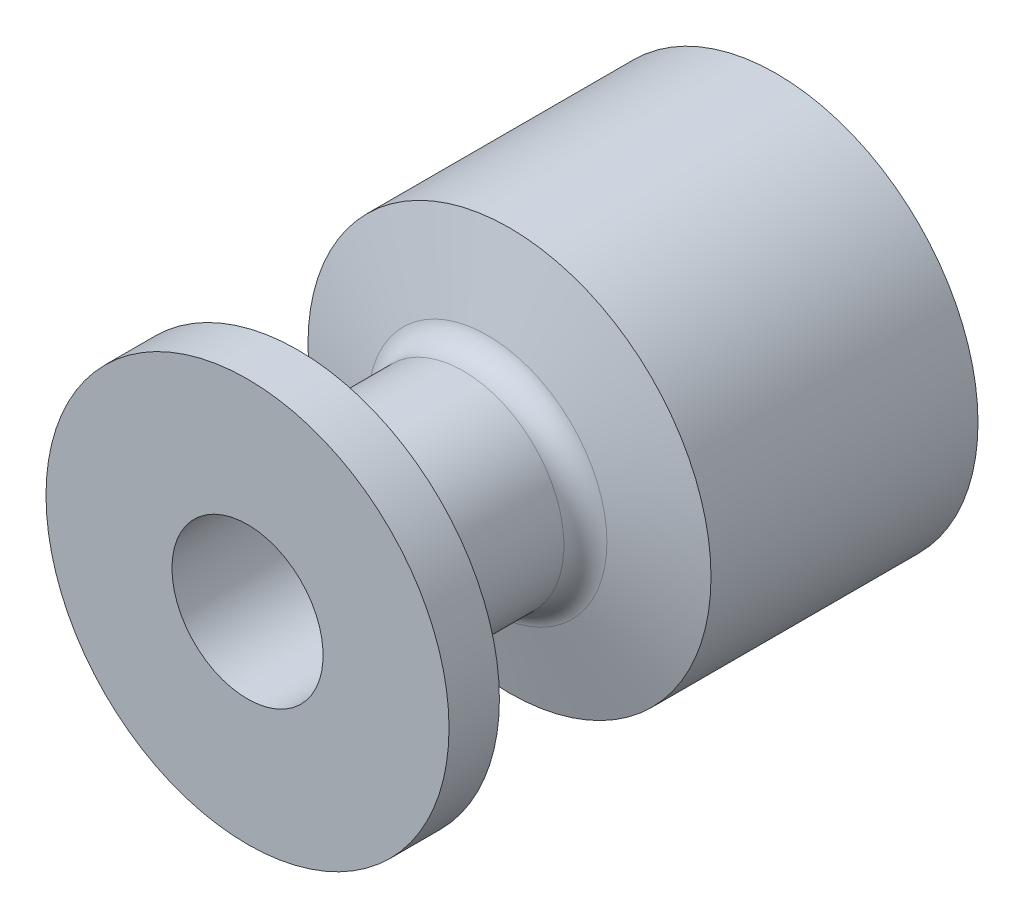
ISO-10303-21;
HEADER;
FILE_DESCRIPTION(('STEP AP214'),'2;1');
FILE_NAME('part.step','',(''),(''),'','','');
FILE_SCHEMA(('AUTOMOTIVE_DESIGN { 1 0 10303 214 1 1 1 1 }'));
ENDSEC;
DATA;
#1=APPLICATION_CONTEXT('core data for automotive mechanical design processes');
#2=APPLICATION_PROTOCOL_DEFINITION('international standard','automotive_design',2000,#1);
#3=PRODUCT_CONTEXT('',#1,'mechanical');
#4=PRODUCT('Part','Part','',(#3));
#5=PRODUCT_RELATED_PRODUCT_CATEGORY('part','',(#4));
#6=PRODUCT_DEFINITION_FORMATION('','',#4);
#7=PRODUCT_DEFINITION_CONTEXT('part definition',#1,'design');
#8=PRODUCT_DEFINITION('design','',#6,#7);
#9=PRODUCT_DEFINITION_SHAPE('','',#8);
#10=(LENGTH_UNIT() NAMED_UNIT(*) SI_UNIT(.MILLI.,.METRE.));
#11=(NAMED_UNIT(*) PLANE_ANGLE_UNIT() SI_UNIT($,.RADIAN.));
#12=(NAMED_UNIT(*) SI_UNIT($,.STERADIAN.) SOLID_ANGLE_UNIT());
#13=UNCERTAINTY_MEASURE_WITH_UNIT(LENGTH_MEASURE(1.E-05),#10,'distance_accuracy_value','');
#14=(GEOMETRIC_REPRESENTATION_CONTEXT(3) GLOBAL_UNCERTAINTY_ASSIGNED_CONTEXT((#13)) GLOBAL_UNIT_ASSIGNED_CONTEXT((#10,
#11,#12)) REPRESENTATION_CONTEXT('',''));
#15=CARTESIAN_POINT('',(0.,0.,0.));
#16=DIRECTION('',(0.,0.,1.));
#17=DIRECTION('',(1.,0.,0.));
#18=AXIS2_PLACEMENT_3D('',#15,#16,#17);
#19=CARTESIAN_POINT('',(0.,0.,10.5));
#20=DIRECTION('',(0.,0.,1.));
#21=DIRECTION('',(1.,0.,0.));
#22=AXIS2_PLACEMENT_3D('',#19,#20,#21);
#23=PLANE('',#22);
#24=CARTESIAN_POINT('',(0.,0.,10.5));
#25=DIRECTION('',(0.,0.,1.));
#26=DIRECTION('',(1.,0.,0.));
#27=AXIS2_PLACEMENT_3D('',#24,#25,#26);
#28=CIRCLE('',#27,4.);
#29=CARTESIAN_POINT('',(-4.,0.,10.5));
#30=VERTEX_POINT('',#29);
#31=EDGE_CURVE('E52',#30,#30,#28,.T.);
#32=ORIENTED_EDGE('',*,*,#31,.T.);
#33=EDGE_LOOP('',(#32));
#34=FACE_BOUND('',#33,.T.);
#35=CARTESIAN_POINT('',(0.,0.,10.5));
#36=DIRECTION('',(0.,0.,1.));
#37=DIRECTION('',(1.,0.,0.));
#38=AXIS2_PLACEMENT_3D('',#35,#36,#37);
#39=CIRCLE('',#38,1.5);
#40=CARTESIAN_POINT('',(-1.5,0.,10.5));
#41=VERTEX_POINT('',#40);
#42=EDGE_CURVE('E56',#41,#41,#39,.T.);
#43=ORIENTED_EDGE('',*,*,#42,.F.);
#44=EDGE_LOOP('',(#43));
#45=FACE_BOUND('',#44,.T.);
#46=ADVANCED_FACE('F32',(#34,#45),#23,.T.);
#47=CARTESIAN_POINT('',(0.,0.,10.5));
#48=DIRECTION('',(0.,0.,-1.));
#49=DIRECTION('',(-1.,0.,0.));
#50=AXIS2_PLACEMENT_3D('',#47,#48,#49);
#51=CYLINDRICAL_SURFACE('',#50,4.);
#52=CARTESIAN_POINT('',(0.,0.,9.5));
#53=DIRECTION('',(0.,0.,-1.));
#54=DIRECTION('',(-1.,0.,0.));
#55=AXIS2_PLACEMENT_3D('',#52,#53,#54);
#56=CIRCLE('',#55,4.);
#57=CARTESIAN_POINT('',(-4.,0.,9.5));
#58=VERTEX_POINT('',#57);
#59=EDGE_CURVE('E65',#58,#58,#56,.T.);
#60=CARTESIAN_POINT('',(-4.,0.,9.5));
#61=CARTESIAN_POINT('',(-4.,0.,9.51041666666667));
#62=CARTESIAN_POINT('',(-4.,0.,9.52083333333334));
#63=CARTESIAN_POINT('',(-4.,0.,9.54166666666667));
#64=CARTESIAN_POINT('',(-4.,0.,9.55208333333333));
#65=CARTESIAN_POINT('',(-4.,0.,9.57291666666667));
#66=CARTESIAN_POINT('',(-4.,0.,9.58333333333333));
#67=CARTESIAN_POINT('',(-4.,0.,9.60416666666667));
#68=CARTESIAN_POINT('',(-4.,0.,9.61458333333333));
#69=CARTESIAN_POINT('',(-4.,0.,9.63541666666667));
#70=CARTESIAN_POINT('',(-4.,0.,9.64583333333333));
#71=CARTESIAN_POINT('',(-4.,0.,9.66666666666667));
#72=CARTESIAN_POINT('',(-4.,0.,9.67708333333333));
#73=CARTESIAN_POINT('',(-4.,0.,9.69791666666667));
#74=CARTESIAN_POINT('',(-4.,0.,9.70833333333333));
#75=CARTESIAN_POINT('',(-4.,0.,9.72916666666667));
#76=CARTESIAN_POINT('',(-4.,0.,9.73958333333333));
#77=CARTESIAN_POINT('',(-4.,0.,9.76041666666667));
#78=CARTESIAN_POINT('',(-4.,0.,9.77083333333333));
#79=CARTESIAN_POINT('',(-4.,0.,9.79166666666667));
#80=CARTESIAN_POINT('',(-4.,0.,9.80208333333333));
#81=CARTESIAN_POINT('',(-4.,0.,9.82291666666667));
#82=CARTESIAN_POINT('',(-4.,0.,9.83333333333333));
#83=CARTESIAN_POINT('',(-4.,0.,9.85416666666667));
#84=CARTESIAN_POINT('',(-4.,0.,9.86458333333333));
#85=CARTESIAN_POINT('',(-4.,0.,9.88541666666667));
#86=CARTESIAN_POINT('',(-4.,0.,9.89583333333333));
#87=CARTESIAN_POINT('',(-4.,0.,9.91666666666667));
#88=CARTESIAN_POINT('',(-4.,0.,9.92708333333333));
#89=CARTESIAN_POINT('',(-4.,0.,9.94791666666667));
#90=CARTESIAN_POINT('',(-4.,0.,9.95833333333333));
#91=CARTESIAN_POINT('',(-4.,0.,9.97916666666667));
#92=CARTESIAN_POINT('',(-4.,0.,9.98958333333333));
#93=CARTESIAN_POINT('',(-4.,0.,10.0104166666667));
#94=CARTESIAN_POINT('',(-4.,0.,10.0208333333333));
#95=CARTESIAN_POINT('',(-4.,0.,10.0416666666667));
#96=CARTESIAN_POINT('',(-4.,0.,10.0520833333333));
#97=CARTESIAN_POINT('',(-4.,0.,10.0729166666667));
#98=CARTESIAN_POINT('',(-4.,0.,10.0833333333333));
#99=CARTESIAN_POINT('',(-4.,0.,10.1041666666667));
#100=CARTESIAN_POINT('',(-4.,0.,10.1145833333333));
#101=CARTESIAN_POINT('',(-4.,0.,10.1354166666667));
#102=CARTESIAN_POINT('',(-4.,0.,10.1458333333333));
#103=CARTESIAN_POINT('',(-4.,0.,10.1666666666667));
#104=CARTESIAN_POINT('',(-4.,0.,10.1770833333333));
#105=CARTESIAN_POINT('',(-4.,0.,10.1979166666667));
#106=CARTESIAN_POINT('',(-4.,0.,10.2083333333333));
#107=CARTESIAN_POINT('',(-4.,0.,10.2291666666667));
#108=CARTESIAN_POINT('',(-4.,0.,10.2395833333333));
#109=CARTESIAN_POINT('',(-4.,0.,10.2604166666667));
#110=CARTESIAN_POINT('',(-4.,0.,10.2708333333333));
#111=CARTESIAN_POINT('',(-4.,0.,10.2916666666667));
#112=CARTESIAN_POINT('',(-4.,0.,10.3020833333333));
#113=CARTESIAN_POINT('',(-4.,0.,10.3229166666667));
#114=CARTESIAN_POINT('',(-4.,0.,10.3333333333333));
#115=CARTESIAN_POINT('',(-4.,0.,10.3541666666667));
#116=CARTESIAN_POINT('',(-4.,0.,10.3645833333333));
#117=CARTESIAN_POINT('',(-4.,0.,10.3854166666667));
#118=CARTESIAN_POINT('',(-4.,0.,10.3958333333333));
#119=CARTESIAN_POINT('',(-4.,0.,10.4166666666667));
#120=CARTESIAN_POINT('',(-4.,0.,10.4270833333333));
#121=CARTESIAN_POINT('',(-4.,0.,10.4479166666667));
#122=CARTESIAN_POINT('',(-4.,0.,10.4583333333333));
#123=CARTESIAN_POINT('',(-4.,0.,10.4791666666667));
#124=CARTESIAN_POINT('',(-4.,0.,10.4895833333333));
#125=CARTESIAN_POINT('',(-4.,0.,10.5));
#126=B_SPLINE_CURVE_WITH_KNOTS('',3,(#60,#61,#62,#63,#64,#65,#66,#67,#68,#69,#70,#71,#72,#73,
#74,#75,#76,#77,#78,#79,#80,#81,#82,#83,#84,#85,#86,#87,#88,#89,#90,#91,#92,#93,#94,#95,#96,#97,
#98,#99,#100,#101,#102,#103,#104,#105,#106,#107,#108,#109,#110,#111,#112,#113,#114,#115,#116,
#117,#118,#119,#120,#121,#122,#123,#124,#125),.UNSPECIFIED.,.F.,.F.,(4,2,2,2,2,2,2,2,2,2,2,2,2,
2,2,2,2,2,2,2,2,2,2,2,2,2,2,2,2,2,2,2,4),(0.,0.0312499999999983,0.0624999999999983,
0.0937499999999983,0.124999999999998,0.156249999999998,0.187499999999998,0.218749999999998,
0.249999999999999,0.281249999999999,0.312499999999999,0.343749999999999,0.374999999999999,
0.406249999999999,0.437499999999999,0.468749999999999,0.499999999999999,0.531249999999997,
0.562499999999997,0.593749999999997,0.624999999999997,0.656249999999997,0.687499999999997,
0.718749999999997,0.749999999999997,0.781249999999997,0.812499999999997,0.843749999999997,
0.874999999999997,0.906249999999997,0.937499999999997,0.968749999999997,0.999999999999997),.UNSPECIFIED.);
#127=EDGE_CURVE('BSEAM98',#58,#30,#126,.T.);
#128=ORIENTED_EDGE('',*,*,#59,.F.);
#129=ORIENTED_EDGE('',*,*,#31,.F.);
#130=ORIENTED_EDGE('',*,*,#127,.T.);
#131=ORIENTED_EDGE('',*,*,#127,.F.);
#132=EDGE_LOOP('',(#128,#130,#129,#131));
#133=FACE_BOUND('',#132,.T.);
#134=ADVANCED_FACE('F98',(#133),#51,.T.);
#135=CARTESIAN_POINT('',(0.,0.,10.5));
#136=DIRECTION('',(0.,0.,-1.));
#137=DIRECTION('',(-1.,0.,0.));
#138=AXIS2_PLACEMENT_3D('',#135,#136,#137);
#139=CYLINDRICAL_SURFACE('',#138,1.5);
#140=CARTESIAN_POINT('',(0.,0.,0.65));
#141=DIRECTION('',(0.,0.,1.));
#142=DIRECTION('',(1.,0.,0.));
#143=AXIS2_PLACEMENT_3D('',#140,#141,#142);
#144=CIRCLE('',#143,1.5);
#145=CARTESIAN_POINT('',(-1.5,0.,0.650000000000001));
#146=VERTEX_POINT('',#145);
#147=EDGE_CURVE('E53',#146,#146,#144,.T.);
#148=CARTESIAN_POINT('',(-1.5,0.,0.650000000000001));
#149=CARTESIAN_POINT('',(-1.5,0.,0.752604166666668));
#150=CARTESIAN_POINT('',(-1.5,0.,0.855208333333335));
#151=CARTESIAN_POINT('',(-1.5,0.,1.06041666666667));
#152=CARTESIAN_POINT('',(-1.5,0.,1.16302083333333));
#153=CARTESIAN_POINT('',(-1.5,0.,1.36822916666667));
#154=CARTESIAN_POINT('',(-1.5,0.,1.47083333333333));
#155=CARTESIAN_POINT('',(-1.5,0.,1.67604166666667));
#156=CARTESIAN_POINT('',(-1.5,0.,1.77864583333333));
#157=CARTESIAN_POINT('',(-1.5,0.,1.98385416666667));
#158=CARTESIAN_POINT('',(-1.5,0.,2.08645833333333));
#159=CARTESIAN_POINT('',(-1.5,0.,2.29166666666667));
#160=CARTESIAN_POINT('',(-1.5,0.,2.39427083333333));
#161=CARTESIAN_POINT('',(-1.5,0.,2.59947916666667));
#162=CARTESIAN_POINT('',(-1.5,0.,2.70208333333333));
#163=CARTESIAN_POINT('',(-1.5,0.,2.90729166666667));
#164=CARTESIAN_POINT('',(-1.5,0.,3.00989583333333));
#165=CARTESIAN_POINT('',(-1.5,0.,3.21510416666667));
#166=CARTESIAN_POINT('',(-1.5,0.,3.31770833333333));
#167=CARTESIAN_POINT('',(-1.5,0.,3.52291666666667));
#168=CARTESIAN_POINT('',(-1.5,0.,3.62552083333333));
#169=CARTESIAN_POINT('',(-1.5,0.,3.83072916666667));
#170=CARTESIAN_POINT('',(-1.5,0.,3.93333333333333));
#171=CARTESIAN_POINT('',(-1.5,0.,4.13854166666667));
#172=CARTESIAN_POINT('',(-1.5,0.,4.24114583333333));
#173=CARTESIAN_POINT('',(-1.5,0.,4.44635416666667));
#174=CARTESIAN_POINT('',(-1.5,0.,4.54895833333333));
#175=CARTESIAN_POINT('',(-1.5,0.,4.75416666666667));
#176=CARTESIAN_POINT('',(-1.5,0.,4.85677083333333));
#177=CARTESIAN_POINT('',(-1.5,0.,5.06197916666667));
#178=CARTESIAN_POINT('',(-1.5,0.,5.16458333333333));
#179=CARTESIAN_POINT('',(-1.5,0.,5.36979166666667));
#180=CARTESIAN_POINT('',(-1.5,0.,5.47239583333333));
#181=CARTESIAN_POINT('',(-1.5,0.,5.67760416666667));
#182=CARTESIAN_POINT('',(-1.5,0.,5.78020833333333));
#183=CARTESIAN_POINT('',(-1.5,0.,5.98541666666667));
#184=CARTESIAN_POINT('',(-1.5,0.,6.08802083333333));
#185=CARTESIAN_POINT('',(-1.5,0.,6.29322916666667));
#186=CARTESIAN_POINT('',(-1.5,0.,6.39583333333333));
#187=CARTESIAN_POINT('',(-1.5,0.,6.60104166666667));
#188=CARTESIAN_POINT('',(-1.5,0.,6.70364583333333));
#189=CARTESIAN_POINT('',(-1.5,0.,6.90885416666667));
#190=CARTESIAN_POINT('',(-1.5,0.,7.01145833333333));
#191=CARTESIAN_POINT('',(-1.5,0.,7.21666666666667));
#192=CARTESIAN_POINT('',(-1.5,0.,7.31927083333333));
#193=CARTESIAN_POINT('',(-1.5,0.,7.52447916666667));
#194=CARTESIAN_POINT('',(-1.5,0.,7.62708333333333));
#195=CARTESIAN_POINT('',(-1.5,0.,7.83229166666667));
#196=CARTESIAN_POINT('',(-1.5,0.,7.93489583333333));
#197=CARTESIAN_POINT('',(-1.5,0.,8.14010416666667));
#198=CARTESIAN_POINT('',(-1.5,0.,8.24270833333333));
#199=CARTESIAN_POINT('',(-1.5,0.,8.44791666666667));
#200=CARTESIAN_POINT('',(-1.5,0.,8.55052083333333));
#201=CARTESIAN_POINT('',(-1.5,0.,8.75572916666667));
#202=CARTESIAN_POINT('',(-1.5,0.,8.85833333333333));
#203=CARTESIAN_POINT('',(-1.5,0.,9.06354166666667));
#204=CARTESIAN_POINT('',(-1.5,0.,9.16614583333333));
#205=CARTESIAN_POINT('',(-1.5,0.,9.37135416666666));
#206=CARTESIAN_POINT('',(-1.5,0.,9.47395833333333));
#207=CARTESIAN_POINT('',(-1.5,0.,9.67916666666667));
#208=CARTESIAN_POINT('',(-1.5,0.,9.78177083333333));
#209=CARTESIAN_POINT('',(-1.5,0.,9.98697916666666));
#210=CARTESIAN_POINT('',(-1.5,0.,10.0895833333333));
#211=CARTESIAN_POINT('',(-1.5,0.,10.2947916666667));
#212=CARTESIAN_POINT('',(-1.5,0.,10.3973958333333));
#213=CARTESIAN_POINT('',(-1.5,0.,10.5));
#214=B_SPLINE_CURVE_WITH_KNOTS('',3,(#148,#149,#150,#151,#152,#153,#154,#155,#156,#157,#158,
#159,#160,#161,#162,#163,#164,#165,#166,#167,#168,#169,#170,#171,#172,#173,#174,#175,#176,#177,
#178,#179,#180,#181,#182,#183,#184,#185,#186,#187,#188,#189,#190,#191,#192,#193,#194,#195,#196,
#197,#198,#199,#200,#201,#202,#203,#204,#205,#206,#207,#208,#209,#210,#211,#212,#213),
.UNSPECIFIED.,.F.,.F.,(4,2,2,2,2,2,2,2,2,2,2,2,2,2,2,2,2,2,2,2,2,2,2,2,2,2,2,2,2,2,2,2,4),(0.,
0.307812500000001,0.615625,0.923437500000001,1.23125,1.5390625,1.846875,2.1546875,2.4625,
2.7703125,3.078125,3.3859375,3.69375,4.0015625,4.309375,4.6171875,4.925,5.2328125,5.540625,
5.8484375,6.15625,6.4640625,6.771875,7.0796875,7.3875,7.6953125,8.003125,8.3109375,8.61875,
8.9265625,9.234375,9.5421875,9.85),.UNSPECIFIED.);
#215=EDGE_CURVE('BSEAM82',#146,#41,#214,.T.);
#216=ORIENTED_EDGE('',*,*,#147,.F.);
#217=ORIENTED_EDGE('',*,*,#42,.T.);
#218=ORIENTED_EDGE('',*,*,#215,.T.);
#219=ORIENTED_EDGE('',*,*,#215,.F.);
#220=EDGE_LOOP('',(#216,#218,#217,#219));
#221=FACE_BOUND('',#220,.T.);
#222=ADVANCED_FACE('F82',(#221),#139,.F.);
#223=CARTESIAN_POINT('',(0.,0.,0.));
#224=DIRECTION('',(0.,0.,-1.));
#225=DIRECTION('',(-1.,0.,0.));
#226=AXIS2_PLACEMENT_3D('',#223,#224,#225);
#227=CONICAL_SURFACE('',#226,3.62463983518624,0.872664625997166);
#228=CARTESIAN_POINT('',(0.,0.,0.65));
#229=DIRECTION('',(0.,0.,-1.));
#230=DIRECTION('',(-1.,0.,0.));
#231=AXIS2_PLACEMENT_3D('',#228,#229,#230);
#232=CIRCLE('',#231,2.85);
#233=CARTESIAN_POINT('',(-2.85,0.,0.65));
#234=VERTEX_POINT('',#233);
#235=EDGE_CURVE('E68',#234,#234,#232,.T.);
#236=ORIENTED_EDGE('',*,*,#235,.F.);
#237=EDGE_LOOP('',(#236));
#238=FACE_BOUND('',#237,.T.);
#239=CARTESIAN_POINT('',(0.,0.,0.));
#240=DIRECTION('',(0.,0.,-1.));
#241=DIRECTION('',(-1.,0.,0.));
#242=AXIS2_PLACEMENT_3D('',#239,#240,#241);
#243=CIRCLE('',#242,3.62463983518624);
#244=CARTESIAN_POINT('',(-3.62463983518624,0.,0.));
#245=VERTEX_POINT('',#244);
#246=EDGE_CURVE('E57',#245,#245,#243,.T.);
#247=ORIENTED_EDGE('',*,*,#246,.T.);
#248=EDGE_LOOP('',(#247));
#249=FACE_BOUND('',#248,.T.);
#250=ADVANCED_FACE('F79',(#238,#249),#227,.F.);
#251=CARTESIAN_POINT('',(-2.85,0.,0.65));
#252=DIRECTION('',(0.,0.,1.));
#253=DIRECTION('',(1.,0.,0.));
#254=AXIS2_PLACEMENT_3D('',#251,#252,#253);
#255=PLANE('',#254);
#256=ORIENTED_EDGE('',*,*,#147,.T.);
#257=EDGE_LOOP('',(#256));
#258=FACE_BOUND('',#257,.T.);
#259=ORIENTED_EDGE('',*,*,#235,.T.);
#260=EDGE_LOOP('',(#259));
#261=FACE_BOUND('',#260,.T.);
#262=ADVANCED_FACE('F77',(#258,#261),#255,.F.);
#263=CARTESIAN_POINT('',(0.,0.,5.83589838486224));
#264=DIRECTION('',(0.,0.,-1.));
#265=DIRECTION('',(-1.,0.,0.));
#266=AXIS2_PLACEMENT_3D('',#263,#264,#265);
#267=CONICAL_SURFACE('',#266,2.,1.30899693899575);
#268=CARTESIAN_POINT('',(0.,0.,5.73659896570719));
#269=DIRECTION('',(0.,0.,-1.));
#270=DIRECTION('',(-1.,0.,0.));
#271=AXIS2_PLACEMENT_3D('',#268,#269,#270);
#272=CIRCLE('',#271,2.37059047744874);
#273=CARTESIAN_POINT('',(-2.37059047744874,0.,5.73659896570719));
#274=VERTEX_POINT('',#273);
#275=EDGE_CURVE('E10',#274,#274,#272,.T.);
#276=ORIENTED_EDGE('',*,*,#275,.T.);
#277=EDGE_LOOP('',(#276));
#278=FACE_BOUND('',#277,.T.);
#279=CARTESIAN_POINT('',(0.,0.,5.3));
#280=DIRECTION('',(0.,0.,-1.));
#281=DIRECTION('',(-1.,0.,0.));
#282=AXIS2_PLACEMENT_3D('',#279,#280,#281);
#283=CIRCLE('',#282,4.);
#284=CARTESIAN_POINT('',(-4.,0.,5.3));
#285=VERTEX_POINT('',#284);
#286=EDGE_CURVE('E69',#285,#285,#283,.T.);
#287=ORIENTED_EDGE('',*,*,#286,.F.);
#288=EDGE_LOOP('',(#287));
#289=FACE_BOUND('',#288,.T.);
#290=ADVANCED_FACE('F116',(#278,#289),#267,.T.);
#291=CARTESIAN_POINT('',(0.,0.,0.));
#292=DIRECTION('',(0.,0.,-1.));
#293=DIRECTION('',(-1.,0.,0.));
#294=AXIS2_PLACEMENT_3D('',#291,#292,#293);
#295=CYLINDRICAL_SURFACE('',#294,2.);
#296=CARTESIAN_POINT('',(0.,0.,8.4868893435315));
#297=DIRECTION('',(0.,0.,-1.));
#298=DIRECTION('',(-1.,0.,0.));
#299=AXIS2_PLACEMENT_3D('',#296,#297,#298);
#300=CIRCLE('',#299,2.);
#301=CARTESIAN_POINT('',(-2.,0.,8.4868893435315));
#302=VERTEX_POINT('',#301);
#303=EDGE_CURVE('E43',#302,#302,#300,.T.);
#304=ORIENTED_EDGE('',*,*,#303,.T.);
#305=EDGE_LOOP('',(#304));
#306=FACE_BOUND('',#305,.T.);
#307=CARTESIAN_POINT('',(0.,0.,6.21956187885172));
#308=DIRECTION('',(0.,0.,-1.));
#309=DIRECTION('',(-1.,0.,0.));
#310=AXIS2_PLACEMENT_3D('',#307,#308,#309);
#311=CIRCLE('',#310,2.);
#312=CARTESIAN_POINT('',(-2.,0.,6.21956187885172));
#313=VERTEX_POINT('',#312);
#314=EDGE_CURVE('E47',#313,#313,#311,.F.);
#315=ORIENTED_EDGE('',*,*,#314,.T.);
#316=EDGE_LOOP('',(#315));
#317=FACE_BOUND('',#316,.T.);
#318=ADVANCED_FACE('F102',(#306,#317),#295,.T.);
#319=CARTESIAN_POINT('',(0.,0.,9.5));
#320=DIRECTION('',(0.,0.,1.));
#321=DIRECTION('',(1.,0.,0.));
#322=AXIS2_PLACEMENT_3D('',#319,#320,#321);
#323=CONICAL_SURFACE('',#322,4.,1.25663706143591);
#324=CARTESIAN_POINT('',(0.,0.,8.96241760167907));
#325=DIRECTION('',(0.,0.,1.));
#326=DIRECTION('',(1.,0.,0.));
#327=AXIS2_PLACEMENT_3D('',#324,#325,#326);
#328=CIRCLE('',#327,2.34549150281252);
#329=CARTESIAN_POINT('',(2.34549150281253,0.,8.96241760167907));
#330=VERTEX_POINT('',#329);
#331=EDGE_CURVE('E39',#330,#330,#328,.T.);
#332=ORIENTED_EDGE('',*,*,#331,.T.);
#333=EDGE_LOOP('',(#332));
#334=FACE_BOUND('',#333,.T.);
#335=ORIENTED_EDGE('',*,*,#59,.T.);
#336=EDGE_LOOP('',(#335));
#337=FACE_BOUND('',#336,.T.);
#338=ADVANCED_FACE('F95',(#334,#337),#323,.T.);
#339=CARTESIAN_POINT('',(0.,0.,0.));
#340=DIRECTION('',(0.,0.,1.));
#341=DIRECTION('',(1.,0.,0.));
#342=AXIS2_PLACEMENT_3D('',#339,#340,#341);
#343=CIRCLE('',#342,4.);
#344=CARTESIAN_POINT('',(-4.,0.,0.));
#345=VERTEX_POINT('',#344);
#346=EDGE_CURVE('E58',#345,#345,#343,.T.);
#347=CARTESIAN_POINT('',(-4.,0.,5.3));
#348=CARTESIAN_POINT('',(-4.,0.,5.24479166666667));
#349=CARTESIAN_POINT('',(-4.,0.,5.18958333333333));
#350=CARTESIAN_POINT('',(-4.,0.,5.07916666666667));
#351=CARTESIAN_POINT('',(-4.,0.,5.02395833333333));
#352=CARTESIAN_POINT('',(-4.,0.,4.91354166666667));
#353=CARTESIAN_POINT('',(-4.,0.,4.85833333333333));
#354=CARTESIAN_POINT('',(-4.,0.,4.74791666666667));
#355=CARTESIAN_POINT('',(-4.,0.,4.69270833333333));
#356=CARTESIAN_POINT('',(-4.,0.,4.58229166666667));
#357=CARTESIAN_POINT('',(-4.,0.,4.52708333333333));
#358=CARTESIAN_POINT('',(-4.,0.,4.41666666666667));
#359=CARTESIAN_POINT('',(-4.,0.,4.36145833333333));
#360=CARTESIAN_POINT('',(-4.,0.,4.25104166666667));
#361=CARTESIAN_POINT('',(-4.,0.,4.19583333333333));
#362=CARTESIAN_POINT('',(-4.,0.,4.08541666666667));
#363=CARTESIAN_POINT('',(-4.,0.,4.03020833333333));
#364=CARTESIAN_POINT('',(-4.,0.,3.91979166666667));
#365=CARTESIAN_POINT('',(-4.,0.,3.86458333333333));
#366=CARTESIAN_POINT('',(-4.,0.,3.75416666666667));
#367=CARTESIAN_POINT('',(-4.,0.,3.69895833333333));
#368=CARTESIAN_POINT('',(-4.,0.,3.58854166666667));
#369=CARTESIAN_POINT('',(-4.,0.,3.53333333333333));
#370=CARTESIAN_POINT('',(-4.,0.,3.42291666666667));
#371=CARTESIAN_POINT('',(-4.,0.,3.36770833333333));
#372=CARTESIAN_POINT('',(-4.,0.,3.25729166666667));
#373=CARTESIAN_POINT('',(-4.,0.,3.20208333333333));
#374=CARTESIAN_POINT('',(-4.,0.,3.09166666666667));
#375=CARTESIAN_POINT('',(-4.,0.,3.03645833333333));
#376=CARTESIAN_POINT('',(-4.,0.,2.92604166666667));
#377=CARTESIAN_POINT('',(-4.,0.,2.87083333333333));
#378=CARTESIAN_POINT('',(-4.,0.,2.76041666666667));
#379=CARTESIAN_POINT('',(-4.,0.,2.70520833333333));
#380=CARTESIAN_POINT('',(-4.,0.,2.59479166666667));
#381=CARTESIAN_POINT('',(-4.,0.,2.53958333333333));
#382=CARTESIAN_POINT('',(-4.,0.,2.42916666666667));
#383=CARTESIAN_POINT('',(-4.,0.,2.37395833333333));
#384=CARTESIAN_POINT('',(-4.,0.,2.26354166666667));
#385=CARTESIAN_POINT('',(-4.,0.,2.20833333333333));
#386=CARTESIAN_POINT('',(-4.,0.,2.09791666666667));
#387=CARTESIAN_POINT('',(-4.,0.,2.04270833333333));
#388=CARTESIAN_POINT('',(-4.,0.,1.93229166666667));
#389=CARTESIAN_POINT('',(-4.,0.,1.87708333333333));
#390=CARTESIAN_POINT('',(-4.,0.,1.76666666666667));
#391=CARTESIAN_POINT('',(-4.,0.,1.71145833333333));
#392=CARTESIAN_POINT('',(-4.,0.,1.60104166666667));
#393=CARTESIAN_POINT('',(-4.,0.,1.54583333333333));
#394=CARTESIAN_POINT('',(-4.,0.,1.43541666666667));
#395=CARTESIAN_POINT('',(-4.,0.,1.38020833333333));
#396=CARTESIAN_POINT('',(-4.,0.,1.26979166666667));
#397=CARTESIAN_POINT('',(-4.,0.,1.21458333333333));
#398=CARTESIAN_POINT('',(-4.,0.,1.10416666666667));
#399=CARTESIAN_POINT('',(-4.,0.,1.04895833333333));
#400=CARTESIAN_POINT('',(-4.,0.,0.938541666666666));
#401=CARTESIAN_POINT('',(-4.,0.,0.883333333333333));
#402=CARTESIAN_POINT('',(-4.,0.,0.772916666666666));
#403=CARTESIAN_POINT('',(-4.,0.,0.717708333333333));
#404=CARTESIAN_POINT('',(-4.,0.,0.607291666666667));
#405=CARTESIAN_POINT('',(-4.,0.,0.552083333333334));
#406=CARTESIAN_POINT('',(-4.,0.,0.441666666666667));
#407=CARTESIAN_POINT('',(-4.,0.,0.386458333333334));
#408=CARTESIAN_POINT('',(-4.,0.,0.276041666666666));
#409=CARTESIAN_POINT('',(-4.,0.,0.220833333333333));
#410=CARTESIAN_POINT('',(-4.,0.,0.110416666666666));
#411=CARTESIAN_POINT('',(-4.,0.,0.055208333333333));
#412=CARTESIAN_POINT('',(-4.,0.,0.));
#413=B_SPLINE_CURVE_WITH_KNOTS('',3,(#347,#348,#349,#350,#351,#352,#353,#354,#355,#356,#357,
#358,#359,#360,#361,#362,#363,#364,#365,#366,#367,#368,#369,#370,#371,#372,#373,#374,#375,#376,
#377,#378,#379,#380,#381,#382,#383,#384,#385,#386,#387,#388,#389,#390,#391,#392,#393,#394,#395,
#396,#397,#398,#399,#400,#401,#402,#403,#404,#405,#406,#407,#408,#409,#410,#411,#412),
.UNSPECIFIED.,.F.,.F.,(4,2,2,2,2,2,2,2,2,2,2,2,2,2,2,2,2,2,2,2,2,2,2,2,2,2,2,2,2,2,2,2,4),(0.,
0.165625,0.33125,0.496875,0.6625,0.828125,0.99375,1.159375,1.325,1.490625,1.65625,1.821875,
1.9875,2.153125,2.31875,2.484375,2.65,2.815625,2.98125,3.146875,3.3125,3.478125,3.64375,
3.809375,3.975,4.140625,4.30625,4.471875,4.6375,4.803125,4.96875,5.134375,5.3),.UNSPECIFIED.);
#414=EDGE_CURVE('BSEAM90',#285,#345,#413,.T.);
#415=ORIENTED_EDGE('',*,*,#286,.T.);
#416=ORIENTED_EDGE('',*,*,#346,.T.);
#417=ORIENTED_EDGE('',*,*,#414,.T.);
#418=ORIENTED_EDGE('',*,*,#414,.F.);
#419=EDGE_LOOP('',(#415,#417,#416,#418));
#420=FACE_BOUND('',#419,.T.);
#421=ADVANCED_FACE('F90',(#420),#51,.T.);
#422=CARTESIAN_POINT('',(0.,0.,0.));
#423=DIRECTION('',(0.,0.,1.));
#424=DIRECTION('',(1.,0.,0.));
#425=AXIS2_PLACEMENT_3D('',#422,#423,#424);
#426=PLANE('',#425);
#427=ORIENTED_EDGE('',*,*,#246,.F.);
#428=EDGE_LOOP('',(#427));
#429=FACE_BOUND('',#428,.T.);
#430=ORIENTED_EDGE('',*,*,#346,.F.);
#431=EDGE_LOOP('',(#430));
#432=FACE_BOUND('',#431,.T.);
#433=ADVANCED_FACE('F86',(#429,#432),#426,.F.);
#434=CARTESIAN_POINT('',(0.,0.,8.4868893435315));
#435=DIRECTION('',(0.,0.,-1.));
#436=DIRECTION('',(-1.,0.,0.));
#437=AXIS2_PLACEMENT_3D('',#434,#435,#436);
#438=TOROIDAL_SURFACE('',#437,2.5,0.5);
#439=ORIENTED_EDGE('',*,*,#331,.F.);
#440=EDGE_LOOP('',(#439));
#441=FACE_BOUND('',#440,.T.);
#442=ORIENTED_EDGE('',*,*,#303,.F.);
#443=EDGE_LOOP('',(#442));
#444=FACE_BOUND('',#443,.T.);
#445=ADVANCED_FACE('F89',(#441,#444),#438,.F.);
#446=CARTESIAN_POINT('',(0.,0.,6.21956187885172));
#447=DIRECTION('',(0.,0.,-1.));
#448=DIRECTION('',(-1.,0.,0.));
#449=AXIS2_PLACEMENT_3D('',#446,#447,#448);
#450=TOROIDAL_SURFACE('',#449,2.5,0.5);
#451=ORIENTED_EDGE('',*,*,#314,.F.);
#452=EDGE_LOOP('',(#451));
#453=FACE_BOUND('',#452,.T.);
#454=ORIENTED_EDGE('',*,*,#275,.F.);
#455=EDGE_LOOP('',(#454));
#456=FACE_BOUND('',#455,.T.);
#457=ADVANCED_FACE('F34',(#453,#456),#450,.F.);
#458=CLOSED_SHELL('',(#46,#134,#222,#250,#262,#290,#318,#338,#421,#433,#445,#457));
#459=MANIFOLD_SOLID_BREP('B2',#458);
#460=ADVANCED_BREP_SHAPE_REPRESENTATION('',(#18,#459),#14);
#461=SHAPE_DEFINITION_REPRESENTATION(#9,#460);
ENDSEC;
END-ISO-10303-21;
